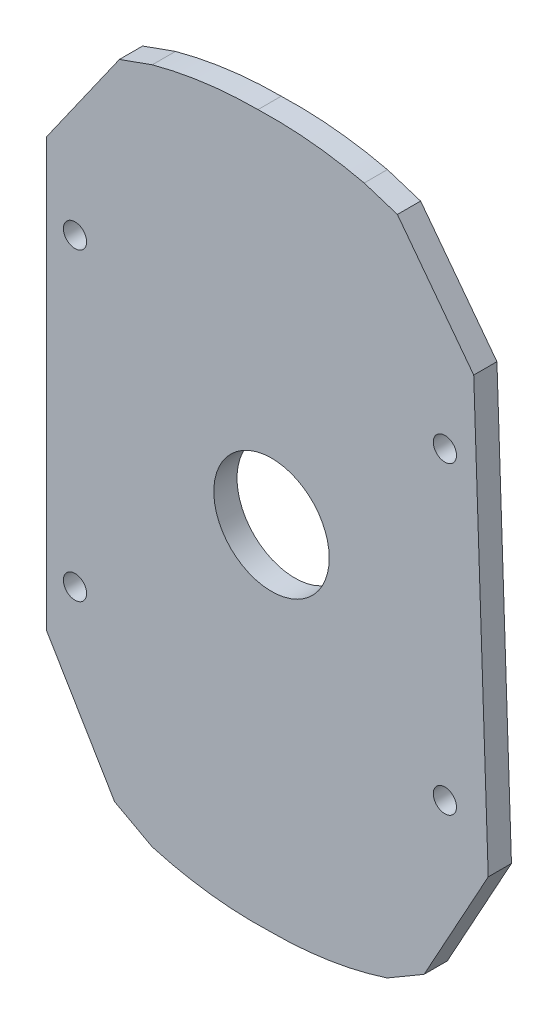
ISO-10303-21;
HEADER;
FILE_DESCRIPTION(('STEP AP214'),'2;1');
FILE_NAME('part.step','',(''),(''),'','','');
FILE_SCHEMA(('AUTOMOTIVE_DESIGN { 1 0 10303 214 1 1 1 1 }'));
ENDSEC;
DATA;
#1=APPLICATION_CONTEXT('core data for automotive mechanical design processes');
#2=APPLICATION_PROTOCOL_DEFINITION('international standard','automotive_design',2000,#1);
#3=PRODUCT_CONTEXT('',#1,'mechanical');
#4=PRODUCT('Part','Part','',(#3));
#5=PRODUCT_RELATED_PRODUCT_CATEGORY('part','',(#4));
#6=PRODUCT_DEFINITION_FORMATION('','',#4);
#7=PRODUCT_DEFINITION_CONTEXT('part definition',#1,'design');
#8=PRODUCT_DEFINITION('design','',#6,#7);
#9=PRODUCT_DEFINITION_SHAPE('','',#8);
#10=(LENGTH_UNIT() NAMED_UNIT(*) SI_UNIT(.MILLI.,.METRE.));
#11=(NAMED_UNIT(*) PLANE_ANGLE_UNIT() SI_UNIT($,.RADIAN.));
#12=(NAMED_UNIT(*) SI_UNIT($,.STERADIAN.) SOLID_ANGLE_UNIT());
#13=UNCERTAINTY_MEASURE_WITH_UNIT(LENGTH_MEASURE(1.E-05),#10,'distance_accuracy_value','');
#14=(GEOMETRIC_REPRESENTATION_CONTEXT(3) GLOBAL_UNCERTAINTY_ASSIGNED_CONTEXT((#13)) GLOBAL_UNIT_ASSIGNED_CONTEXT((#10,
#11,#12)) REPRESENTATION_CONTEXT('',''));
#15=CARTESIAN_POINT('',(0.,0.,0.));
#16=DIRECTION('',(0.,0.,1.));
#17=DIRECTION('',(1.,0.,0.));
#18=AXIS2_PLACEMENT_3D('',#15,#16,#17);
#19=CARTESIAN_POINT('',(129.915894371907,105.92812204103,3.));
#20=DIRECTION('',(0.,0.,-1.));
#21=DIRECTION('',(-1.,0.,0.));
#22=AXIS2_PLACEMENT_3D('',#19,#20,#21);
#23=CYLINDRICAL_SURFACE('',#22,52.2440105298206);
#24=CARTESIAN_POINT('',(129.915894371907,105.92812204103,0.));
#25=DIRECTION('',(0.,0.,1.));
#26=DIRECTION('',(-1.,0.,0.));
#27=AXIS2_PLACEMENT_3D('',#24,#25,#26);
#28=CIRCLE('',#27,52.2440105298206);
#29=CARTESIAN_POINT('',(129.915894371907,158.172132570851,0.));
#30=VERTEX_POINT('',#29);
#31=CARTESIAN_POINT('',(116.251704745824,156.353577498591,0.));
#32=VERTEX_POINT('',#31);
#33=EDGE_CURVE('E165',#30,#32,#28,.T.);
#34=ORIENTED_EDGE('',*,*,#33,.T.);
#35=DIRECTION('',(0.,0.,-1.));
#36=VECTOR('',#35,1.);
#37=CARTESIAN_POINT('',(116.251704745824,156.353577498591,3.));
#38=LINE('',#37,#36);
#39=CARTESIAN_POINT('',(116.251704745824,156.353577498591,3.));
#40=VERTEX_POINT('',#39);
#41=EDGE_CURVE('E11',#40,#32,#38,.T.);
#42=ORIENTED_EDGE('',*,*,#41,.F.);
#43=CARTESIAN_POINT('',(129.915894371907,105.92812204103,3.));
#44=DIRECTION('',(0.,0.,1.));
#45=DIRECTION('',(-1.,0.,0.));
#46=AXIS2_PLACEMENT_3D('',#43,#44,#45);
#47=CIRCLE('',#46,52.2440105298206);
#48=CARTESIAN_POINT('',(129.915894371907,158.172132570851,3.));
#49=VERTEX_POINT('',#48);
#50=EDGE_CURVE('E192',#49,#40,#47,.T.);
#51=ORIENTED_EDGE('',*,*,#50,.F.);
#52=DIRECTION('',(0.,0.,-1.));
#53=VECTOR('',#52,1.);
#54=CARTESIAN_POINT('',(129.915894371907,158.172132570851,3.));
#55=LINE('',#54,#53);
#56=EDGE_CURVE('E161',#49,#30,#55,.T.);
#57=ORIENTED_EDGE('',*,*,#56,.T.);
#58=EDGE_LOOP('',(#34,#42,#51,#57));
#59=FACE_BOUND('',#58,.T.);
#60=ADVANCED_FACE('F33',(#59),#23,.T.);
#61=CARTESIAN_POINT('',(116.251704745824,156.353577498591,3.));
#62=DIRECTION('',(0.336947899680271,-0.941523293870658,0.));
#63=DIRECTION('',(0.941523293870658,0.336947899680271,0.));
#64=AXIS2_PLACEMENT_3D('',#61,#62,#63);
#65=PLANE('',#64);
#66=DIRECTION('',(-0.941523293870658,-0.336947899680271,0.));
#67=VECTOR('',#66,1.);
#68=CARTESIAN_POINT('',(116.251704745824,156.353577498591,0.));
#69=LINE('',#68,#67);
#70=CARTESIAN_POINT('',(112.006054703556,154.834164358382,0.));
#71=VERTEX_POINT('',#70);
#72=EDGE_CURVE('E168',#32,#71,#69,.T.);
#73=ORIENTED_EDGE('',*,*,#72,.T.);
#74=DIRECTION('',(0.,0.,-1.));
#75=VECTOR('',#74,1.);
#76=CARTESIAN_POINT('',(112.006054703556,154.834164358382,3.));
#77=LINE('',#76,#75);
#78=CARTESIAN_POINT('',(112.006054703556,154.834164358382,3.));
#79=VERTEX_POINT('',#78);
#80=EDGE_CURVE('E41',#79,#71,#77,.T.);
#81=ORIENTED_EDGE('',*,*,#80,.F.);
#82=DIRECTION('',(-0.941523293870658,-0.336947899680271,0.));
#83=VECTOR('',#82,1.);
#84=CARTESIAN_POINT('',(116.251704745824,156.353577498591,3.));
#85=LINE('',#84,#83);
#86=EDGE_CURVE('E110',#40,#79,#85,.T.);
#87=ORIENTED_EDGE('',*,*,#86,.F.);
#88=ORIENTED_EDGE('',*,*,#41,.T.);
#89=EDGE_LOOP('',(#73,#81,#87,#88));
#90=FACE_BOUND('',#89,.T.);
#91=ADVANCED_FACE('F281',(#90),#65,.F.);
#92=CARTESIAN_POINT('',(112.006054703556,154.834164358382,3.));
#93=DIRECTION('',(0.817602562275912,-0.575782988772561,0.));
#94=DIRECTION('',(0.575782988772561,0.817602562275912,0.));
#95=AXIS2_PLACEMENT_3D('',#92,#93,#94);
#96=PLANE('',#95);
#97=DIRECTION('',(-0.575782988772561,-0.817602562275912,0.));
#98=VECTOR('',#97,1.);
#99=CARTESIAN_POINT('',(112.006054703556,154.834164358382,0.));
#100=LINE('',#99,#98);
#101=CARTESIAN_POINT('',(102.590821764849,141.464685361579,0.));
#102=VERTEX_POINT('',#101);
#103=EDGE_CURVE('E171',#71,#102,#100,.T.);
#104=ORIENTED_EDGE('',*,*,#103,.T.);
#105=DIRECTION('',(0.,0.,-1.));
#106=VECTOR('',#105,1.);
#107=CARTESIAN_POINT('',(102.590821764849,141.464685361579,3.));
#108=LINE('',#107,#106);
#109=CARTESIAN_POINT('',(102.590821764849,141.464685361579,3.));
#110=VERTEX_POINT('',#109);
#111=EDGE_CURVE('E217',#110,#102,#108,.T.);
#112=ORIENTED_EDGE('',*,*,#111,.F.);
#113=DIRECTION('',(-0.575782988772561,-0.817602562275912,0.));
#114=VECTOR('',#113,1.);
#115=CARTESIAN_POINT('',(112.006054703556,154.834164358382,3.));
#116=LINE('',#115,#114);
#117=EDGE_CURVE('E225',#79,#110,#116,.T.);
#118=ORIENTED_EDGE('',*,*,#117,.F.);
#119=ORIENTED_EDGE('',*,*,#80,.T.);
#120=EDGE_LOOP('',(#104,#112,#118,#119));
#121=FACE_BOUND('',#120,.T.);
#122=ADVANCED_FACE('F223',(#121),#96,.F.);
#123=CARTESIAN_POINT('',(102.590821764849,141.464685361579,3.));
#124=DIRECTION('',(1.,0.,0.));
#125=DIRECTION('',(0.,0.,-1.));
#126=AXIS2_PLACEMENT_3D('',#123,#124,#125);
#127=PLANE('',#126);
#128=DIRECTION('',(0.,-1.,0.));
#129=VECTOR('',#128,1.);
#130=CARTESIAN_POINT('',(102.590821764849,141.464685361579,0.));
#131=LINE('',#130,#129);
#132=CARTESIAN_POINT('',(102.590821764849,86.2136329812577,0.));
#133=VERTEX_POINT('',#132);
#134=EDGE_CURVE('E173',#102,#133,#131,.T.);
#135=ORIENTED_EDGE('',*,*,#134,.T.);
#136=DIRECTION('',(0.,0.,-1.));
#137=VECTOR('',#136,1.);
#138=CARTESIAN_POINT('',(102.590821764849,86.2136329812577,3.));
#139=LINE('',#138,#137);
#140=CARTESIAN_POINT('',(102.590821764849,86.2136329812577,3.));
#141=VERTEX_POINT('',#140);
#142=EDGE_CURVE('E214',#141,#133,#139,.T.);
#143=ORIENTED_EDGE('',*,*,#142,.F.);
#144=DIRECTION('',(0.,-1.,0.));
#145=VECTOR('',#144,1.);
#146=CARTESIAN_POINT('',(102.590821764849,141.464685361579,3.));
#147=LINE('',#146,#145);
#148=EDGE_CURVE('E243',#110,#141,#147,.T.);
#149=ORIENTED_EDGE('',*,*,#148,.F.);
#150=ORIENTED_EDGE('',*,*,#111,.T.);
#151=EDGE_LOOP('',(#135,#143,#149,#150));
#152=FACE_BOUND('',#151,.T.);
#153=ADVANCED_FACE('F234',(#152),#127,.F.);
#154=CARTESIAN_POINT('',(102.590821764849,86.2136329812577,3.));
#155=DIRECTION('',(0.859080360795223,0.5118407307903,0.));
#156=DIRECTION('',(-0.5118407307903,0.859080360795223,0.));
#157=AXIS2_PLACEMENT_3D('',#154,#155,#156);
#158=PLANE('',#157);
#159=DIRECTION('',(0.5118407307903,-0.859080360795223,0.));
#160=VECTOR('',#159,1.);
#161=CARTESIAN_POINT('',(102.590821764849,86.2136329812577,0.));
#162=LINE('',#161,#160);
#163=CARTESIAN_POINT('',(111.38506815839,71.4532516551767,0.));
#164=VERTEX_POINT('',#163);
#165=EDGE_CURVE('E175',#133,#164,#162,.T.);
#166=ORIENTED_EDGE('',*,*,#165,.T.);
#167=DIRECTION('',(0.,0.,-1.));
#168=VECTOR('',#167,1.);
#169=CARTESIAN_POINT('',(111.38506815839,71.4532516551767,3.));
#170=LINE('',#169,#168);
#171=CARTESIAN_POINT('',(111.38506815839,71.4532516551767,3.));
#172=VERTEX_POINT('',#171);
#173=EDGE_CURVE('E211',#172,#164,#170,.T.);
#174=ORIENTED_EDGE('',*,*,#173,.F.);
#175=DIRECTION('',(0.5118407307903,-0.859080360795223,0.));
#176=VECTOR('',#175,1.);
#177=CARTESIAN_POINT('',(102.590821764849,86.2136329812577,3.));
#178=LINE('',#177,#176);
#179=EDGE_CURVE('E240',#141,#172,#178,.T.);
#180=ORIENTED_EDGE('',*,*,#179,.F.);
#181=ORIENTED_EDGE('',*,*,#142,.T.);
#182=EDGE_LOOP('',(#166,#174,#180,#181));
#183=FACE_BOUND('',#182,.T.);
#184=ADVANCED_FACE('F238',(#183),#158,.F.);
#185=CARTESIAN_POINT('',(111.38506815839,71.4532516551767,3.));
#186=DIRECTION('',(0.476038132608103,0.879424639354044,0.));
#187=DIRECTION('',(-0.879424639354044,0.476038132608103,0.));
#188=AXIS2_PLACEMENT_3D('',#185,#186,#187);
#189=PLANE('',#188);
#190=DIRECTION('',(0.879424639354044,-0.476038132608103,0.));
#191=VECTOR('',#190,1.);
#192=CARTESIAN_POINT('',(111.38506815839,71.4532516551767,0.));
#193=LINE('',#192,#191);
#194=CARTESIAN_POINT('',(116.251704745824,68.8189104171758,0.));
#195=VERTEX_POINT('',#194);
#196=EDGE_CURVE('E177',#164,#195,#193,.T.);
#197=ORIENTED_EDGE('',*,*,#196,.T.);
#198=DIRECTION('',(0.,0.,-1.));
#199=VECTOR('',#198,1.);
#200=CARTESIAN_POINT('',(116.251704745824,68.8189104171758,3.));
#201=LINE('',#200,#199);
#202=CARTESIAN_POINT('',(116.251704745824,68.8189104171758,3.));
#203=VERTEX_POINT('',#202);
#204=EDGE_CURVE('E208',#203,#195,#201,.T.);
#205=ORIENTED_EDGE('',*,*,#204,.F.);
#206=DIRECTION('',(0.879424639354044,-0.476038132608103,0.));
#207=VECTOR('',#206,1.);
#208=CARTESIAN_POINT('',(111.38506815839,71.4532516551767,3.));
#209=LINE('',#208,#207);
#210=EDGE_CURVE('E242',#172,#203,#209,.T.);
#211=ORIENTED_EDGE('',*,*,#210,.F.);
#212=ORIENTED_EDGE('',*,*,#173,.T.);
#213=EDGE_LOOP('',(#197,#205,#211,#212));
#214=FACE_BOUND('',#213,.T.);
#215=ADVANCED_FACE('F294',(#214),#189,.F.);
#216=CARTESIAN_POINT('',(129.643912803425,115.47761332187,3.));
#217=DIRECTION('',(0.,0.,-1.));
#218=DIRECTION('',(-1.,0.,0.));
#219=AXIS2_PLACEMENT_3D('',#216,#217,#218);
#220=CYLINDRICAL_SURFACE('',#219,48.5426183204673);
#221=CARTESIAN_POINT('',(129.643912803425,115.47761332187,0.));
#222=DIRECTION('',(0.,0.,1.));
#223=DIRECTION('',(1.,0.,0.));
#224=AXIS2_PLACEMENT_3D('',#221,#222,#223);
#225=CIRCLE('',#224,48.5426183204673);
#226=CARTESIAN_POINT('',(131.464672298688,66.9691539743808,0.));
#227=VERTEX_POINT('',#226);
#228=EDGE_CURVE('E179',#195,#227,#225,.T.);
#229=ORIENTED_EDGE('',*,*,#228,.T.);
#230=DIRECTION('',(0.,0.,-1.));
#231=VECTOR('',#230,1.);
#232=CARTESIAN_POINT('',(131.464672298688,66.9691539743808,3.));
#233=LINE('',#232,#231);
#234=CARTESIAN_POINT('',(131.464672298688,66.9691539743808,3.));
#235=VERTEX_POINT('',#234);
#236=EDGE_CURVE('E205',#235,#227,#233,.T.);
#237=ORIENTED_EDGE('',*,*,#236,.F.);
#238=CARTESIAN_POINT('',(129.643912803425,115.47761332187,3.));
#239=DIRECTION('',(0.,0.,1.));
#240=DIRECTION('',(1.,0.,0.));
#241=AXIS2_PLACEMENT_3D('',#238,#239,#240);
#242=CIRCLE('',#241,48.5426183204673);
#243=EDGE_CURVE('E245',#203,#235,#242,.T.);
#244=ORIENTED_EDGE('',*,*,#243,.F.);
#245=ORIENTED_EDGE('',*,*,#204,.T.);
#246=EDGE_LOOP('',(#229,#237,#244,#245));
#247=FACE_BOUND('',#246,.T.);
#248=ADVANCED_FACE('F297',(#247),#220,.T.);
#249=CARTESIAN_POINT('',(131.637348655565,115.511465170721,3.));
#250=DIRECTION('',(0.,0.,-1.));
#251=DIRECTION('',(-1.,0.,0.));
#252=AXIS2_PLACEMENT_3D('',#249,#250,#251);
#253=CYLINDRICAL_SURFACE('',#252,48.5426183204674);
#254=CARTESIAN_POINT('',(131.637348655565,115.511465170721,0.));
#255=DIRECTION('',(0.,0.,1.));
#256=DIRECTION('',(-1.,0.,0.));
#257=AXIS2_PLACEMENT_3D('',#254,#255,#256);
#258=CIRCLE('',#257,48.5426183204674);
#259=CARTESIAN_POINT('',(146.606062492151,69.3343777843889,0.));
#260=VERTEX_POINT('',#259);
#261=EDGE_CURVE('E181',#227,#260,#258,.T.);
#262=ORIENTED_EDGE('',*,*,#261,.T.);
#263=DIRECTION('',(0.,0.,-1.));
#264=VECTOR('',#263,1.);
#265=CARTESIAN_POINT('',(146.606062492151,69.3343777843889,3.));
#266=LINE('',#265,#264);
#267=CARTESIAN_POINT('',(146.606062492151,69.3343777843889,3.));
#268=VERTEX_POINT('',#267);
#269=EDGE_CURVE('E202',#268,#260,#266,.T.);
#270=ORIENTED_EDGE('',*,*,#269,.F.);
#271=CARTESIAN_POINT('',(131.637348655565,115.511465170721,3.));
#272=DIRECTION('',(0.,0.,1.));
#273=DIRECTION('',(-1.,0.,0.));
#274=AXIS2_PLACEMENT_3D('',#271,#272,#273);
#275=CIRCLE('',#274,48.5426183204674);
#276=EDGE_CURVE('E251',#235,#268,#275,.T.);
#277=ORIENTED_EDGE('',*,*,#276,.F.);
#278=ORIENTED_EDGE('',*,*,#236,.T.);
#279=EDGE_LOOP('',(#262,#270,#277,#278));
#280=FACE_BOUND('',#279,.T.);
#281=ADVANCED_FACE('F301',(#280),#253,.T.);
#282=CARTESIAN_POINT('',(151.380447861165,72.1324395743667,3.));
#283=DIRECTION('',(-0.505623223828784,0.862754400466893,0.));
#284=DIRECTION('',(-0.862754400466893,-0.505623223828784,0.));
#285=AXIS2_PLACEMENT_3D('',#282,#283,#284);
#286=PLANE('',#285);
#287=DIRECTION('',(0.862754400466893,0.505623223828784,0.));
#288=VECTOR('',#287,1.);
#289=CARTESIAN_POINT('',(151.380447861165,72.1324395743667,0.));
#290=LINE('',#289,#288);
#291=CARTESIAN_POINT('',(151.380447861165,72.1324395743667,0.));
#292=VERTEX_POINT('',#291);
#293=EDGE_CURVE('E183',#260,#292,#290,.T.);
#294=ORIENTED_EDGE('',*,*,#293,.T.);
#295=DIRECTION('',(0.,0.,-1.));
#296=VECTOR('',#295,1.);
#297=CARTESIAN_POINT('',(151.380447861165,72.1324395743667,3.));
#298=LINE('',#297,#296);
#299=CARTESIAN_POINT('',(151.380447861165,72.1324395743667,3.));
#300=VERTEX_POINT('',#299);
#301=EDGE_CURVE('E199',#300,#292,#298,.T.);
#302=ORIENTED_EDGE('',*,*,#301,.F.);
#303=DIRECTION('',(0.862754400466893,0.505623223828784,0.));
#304=VECTOR('',#303,1.);
#305=CARTESIAN_POINT('',(151.380447861165,72.1324395743667,3.));
#306=LINE('',#305,#304);
#307=EDGE_CURVE('E253',#268,#300,#306,.T.);
#308=ORIENTED_EDGE('',*,*,#307,.F.);
#309=ORIENTED_EDGE('',*,*,#269,.T.);
#310=EDGE_LOOP('',(#294,#302,#308,#309));
#311=FACE_BOUND('',#310,.T.);
#312=ADVANCED_FACE('F305',(#311),#286,.F.);
#313=CARTESIAN_POINT('',(159.668456590164,87.1829059402191,3.));
#314=DIRECTION('',(-0.8759638243808,0.482376801241688,0.));
#315=DIRECTION('',(-0.482376801241688,-0.8759638243808,0.));
#316=AXIS2_PLACEMENT_3D('',#313,#314,#315);
#317=PLANE('',#316);
#318=DIRECTION('',(0.482376801241688,0.8759638243808,0.));
#319=VECTOR('',#318,1.);
#320=CARTESIAN_POINT('',(159.668456590164,87.1829059402191,0.));
#321=LINE('',#320,#319);
#322=CARTESIAN_POINT('',(159.668456590164,87.1829059402191,0.));
#323=VERTEX_POINT('',#322);
#324=EDGE_CURVE('E185',#292,#323,#321,.T.);
#325=ORIENTED_EDGE('',*,*,#324,.T.);
#326=DIRECTION('',(0.,0.,-1.));
#327=VECTOR('',#326,1.);
#328=CARTESIAN_POINT('',(159.668456590164,87.1829059402191,3.));
#329=LINE('',#328,#327);
#330=CARTESIAN_POINT('',(159.668456590164,87.1829059402191,3.));
#331=VERTEX_POINT('',#330);
#332=EDGE_CURVE('E196',#331,#323,#329,.T.);
#333=ORIENTED_EDGE('',*,*,#332,.F.);
#334=DIRECTION('',(0.482376801241688,0.8759638243808,0.));
#335=VECTOR('',#334,1.);
#336=CARTESIAN_POINT('',(159.668456590164,87.1829059402191,3.));
#337=LINE('',#336,#335);
#338=EDGE_CURVE('E255',#300,#331,#337,.T.);
#339=ORIENTED_EDGE('',*,*,#338,.F.);
#340=ORIENTED_EDGE('',*,*,#301,.T.);
#341=EDGE_LOOP('',(#325,#333,#339,#340));
#342=FACE_BOUND('',#341,.T.);
#343=ADVANCED_FACE('F261',(#342),#317,.F.);
#344=CARTESIAN_POINT('',(157.792488460064,142.402101268546,3.));
#345=DIRECTION('',(-0.999423412756455,-0.0339535275669755,0.));
#346=DIRECTION('',(0.0339535275669755,-0.999423412756455,0.));
#347=AXIS2_PLACEMENT_3D('',#344,#345,#346);
#348=PLANE('',#347);
#349=DIRECTION('',(-0.0339535275669755,0.999423412756455,0.));
#350=VECTOR('',#349,1.);
#351=CARTESIAN_POINT('',(157.792488460064,142.402101268546,0.));
#352=LINE('',#351,#350);
#353=CARTESIAN_POINT('',(157.792488460064,142.402101268546,0.));
#354=VERTEX_POINT('',#353);
#355=EDGE_CURVE('E187',#323,#354,#352,.T.);
#356=ORIENTED_EDGE('',*,*,#355,.T.);
#357=DIRECTION('',(0.,0.,-1.));
#358=VECTOR('',#357,1.);
#359=CARTESIAN_POINT('',(157.792488460064,142.402101268546,3.));
#360=LINE('',#359,#358);
#361=CARTESIAN_POINT('',(157.792488460064,142.402101268546,3.));
#362=VERTEX_POINT('',#361);
#363=EDGE_CURVE('E156',#362,#354,#360,.T.);
#364=ORIENTED_EDGE('',*,*,#363,.F.);
#365=DIRECTION('',(-0.0339535275669755,0.999423412756455,0.));
#366=VECTOR('',#365,1.);
#367=CARTESIAN_POINT('',(157.792488460064,142.402101268546,3.));
#368=LINE('',#367,#366);
#369=EDGE_CURVE('E147',#331,#362,#368,.T.);
#370=ORIENTED_EDGE('',*,*,#369,.F.);
#371=ORIENTED_EDGE('',*,*,#332,.T.);
#372=EDGE_LOOP('',(#356,#364,#370,#371));
#373=FACE_BOUND('',#372,.T.);
#374=ADVANCED_FACE('F265',(#373),#348,.F.);
#375=CARTESIAN_POINT('',(147.928743250891,155.444191223172,3.));
#376=DIRECTION('',(-0.79758127948633,-0.603211490783248,0.));
#377=DIRECTION('',(0.603211490783249,-0.79758127948633,0.));
#378=AXIS2_PLACEMENT_3D('',#375,#376,#377);
#379=PLANE('',#378);
#380=DIRECTION('',(-0.603211490783248,0.79758127948633,0.));
#381=VECTOR('',#380,1.);
#382=CARTESIAN_POINT('',(147.928743250891,155.444191223172,0.));
#383=LINE('',#382,#381);
#384=CARTESIAN_POINT('',(147.928743250891,155.444191223172,0.));
#385=VERTEX_POINT('',#384);
#386=EDGE_CURVE('E155',#354,#385,#383,.T.);
#387=ORIENTED_EDGE('',*,*,#386,.T.);
#388=DIRECTION('',(0.,0.,-1.));
#389=VECTOR('',#388,1.);
#390=CARTESIAN_POINT('',(147.928743250891,155.444191223172,3.));
#391=LINE('',#390,#389);
#392=CARTESIAN_POINT('',(147.928743250891,155.444191223172,3.));
#393=VERTEX_POINT('',#392);
#394=EDGE_CURVE('E152',#393,#385,#391,.T.);
#395=ORIENTED_EDGE('',*,*,#394,.F.);
#396=DIRECTION('',(-0.603211490783248,0.79758127948633,0.));
#397=VECTOR('',#396,1.);
#398=CARTESIAN_POINT('',(147.928743250891,155.444191223172,3.));
#399=LINE('',#398,#397);
#400=EDGE_CURVE('E141',#362,#393,#399,.T.);
#401=ORIENTED_EDGE('',*,*,#400,.F.);
#402=ORIENTED_EDGE('',*,*,#363,.T.);
#403=EDGE_LOOP('',(#387,#395,#401,#402));
#404=FACE_BOUND('',#403,.T.);
#405=ADVANCED_FACE('F153',(#404),#379,.F.);
#406=CARTESIAN_POINT('',(143.633951760336,156.818573493397,3.));
#407=DIRECTION('',(-0.304785582706198,-0.952420993350337,0.));
#408=DIRECTION('',(0.952420993350337,-0.304785582706198,0.));
#409=AXIS2_PLACEMENT_3D('',#406,#407,#408);
#410=PLANE('',#409);
#411=DIRECTION('',(-0.952420993350337,0.304785582706198,0.));
#412=VECTOR('',#411,1.);
#413=CARTESIAN_POINT('',(143.633951760336,156.818573493397,0.));
#414=LINE('',#413,#412);
#415=CARTESIAN_POINT('',(143.633951760336,156.818573493397,0.));
#416=VERTEX_POINT('',#415);
#417=EDGE_CURVE('E96',#385,#416,#414,.T.);
#418=ORIENTED_EDGE('',*,*,#417,.T.);
#419=DIRECTION('',(0.,0.,-1.));
#420=VECTOR('',#419,1.);
#421=CARTESIAN_POINT('',(143.633951760336,156.818573493397,3.));
#422=LINE('',#421,#420);
#423=CARTESIAN_POINT('',(143.633951760336,156.818573493397,3.));
#424=VERTEX_POINT('',#423);
#425=EDGE_CURVE('E157',#424,#416,#422,.T.);
#426=ORIENTED_EDGE('',*,*,#425,.F.);
#427=DIRECTION('',(-0.952420993350337,0.304785582706198,0.));
#428=VECTOR('',#427,1.);
#429=CARTESIAN_POINT('',(143.633951760336,156.818573493397,3.));
#430=LINE('',#429,#428);
#431=EDGE_CURVE('E145',#393,#424,#430,.T.);
#432=ORIENTED_EDGE('',*,*,#431,.F.);
#433=ORIENTED_EDGE('',*,*,#394,.T.);
#434=EDGE_LOOP('',(#418,#426,#432,#433));
#435=FACE_BOUND('',#434,.T.);
#436=ADVANCED_FACE('F159',(#435),#410,.F.);
#437=CARTESIAN_POINT('',(131.689762823641,105.958245271053,3.));
#438=DIRECTION('',(0.,0.,-1.));
#439=DIRECTION('',(-1.,0.,0.));
#440=AXIS2_PLACEMENT_3D('',#437,#438,#439);
#441=CYLINDRICAL_SURFACE('',#440,52.2440105298206);
#442=CARTESIAN_POINT('',(131.689762823641,105.958245271053,0.));
#443=DIRECTION('',(0.,0.,1.));
#444=DIRECTION('',(1.,0.,0.));
#445=AXIS2_PLACEMENT_3D('',#442,#443,#444);
#446=CIRCLE('',#445,52.2440105298206);
#447=EDGE_CURVE('E102',#416,#30,#446,.T.);
#448=ORIENTED_EDGE('',*,*,#447,.T.);
#449=ORIENTED_EDGE('',*,*,#56,.F.);
#450=CARTESIAN_POINT('',(131.689762823641,105.958245271053,3.));
#451=DIRECTION('',(0.,0.,1.));
#452=DIRECTION('',(1.,0.,0.));
#453=AXIS2_PLACEMENT_3D('',#450,#451,#452);
#454=CIRCLE('',#453,52.2440105298206);
#455=EDGE_CURVE('E49',#424,#49,#454,.T.);
#456=ORIENTED_EDGE('',*,*,#455,.F.);
#457=ORIENTED_EDGE('',*,*,#425,.T.);
#458=EDGE_LOOP('',(#448,#449,#456,#457));
#459=FACE_BOUND('',#458,.T.);
#460=ADVANCED_FACE('F269',(#459),#441,.T.);
#461=CARTESIAN_POINT('',(129.915894371907,105.92812204103,3.));
#462=DIRECTION('',(0.,0.,-1.));
#463=DIRECTION('',(-1.,0.,0.));
#464=AXIS2_PLACEMENT_3D('',#461,#462,#463);
#465=PLANE('',#464);
#466=CARTESIAN_POINT('',(106.270821764849,92.9436329812577,3.));
#467=DIRECTION('',(0.,0.,1.));
#468=DIRECTION('',(1.,0.,0.));
#469=AXIS2_PLACEMENT_3D('',#466,#467,#468);
#470=CIRCLE('',#469,1.5);
#471=CARTESIAN_POINT('',(107.770821764849,92.9436329812577,3.));
#472=VERTEX_POINT('',#471);
#473=EDGE_CURVE('E401',#472,#472,#470,.T.);
#474=ORIENTED_EDGE('',*,*,#473,.F.);
#475=EDGE_LOOP('',(#474));
#476=FACE_BOUND('',#475,.T.);
#477=CARTESIAN_POINT('',(154.065868873458,132.294685361579,3.));
#478=DIRECTION('',(0.,0.,1.));
#479=DIRECTION('',(1.,0.,0.));
#480=AXIS2_PLACEMENT_3D('',#477,#478,#479);
#481=CIRCLE('',#480,1.5);
#482=CARTESIAN_POINT('',(155.565868873458,132.294685361579,3.));
#483=VERTEX_POINT('',#482);
#484=EDGE_CURVE('E407',#483,#483,#481,.T.);
#485=ORIENTED_EDGE('',*,*,#484,.F.);
#486=EDGE_LOOP('',(#485));
#487=FACE_BOUND('',#486,.T.);
#488=CARTESIAN_POINT('',(154.065868873458,92.9436329812577,3.));
#489=DIRECTION('',(0.,0.,1.));
#490=DIRECTION('',(1.,0.,0.));
#491=AXIS2_PLACEMENT_3D('',#488,#489,#490);
#492=CIRCLE('',#491,1.5);
#493=CARTESIAN_POINT('',(155.565868873458,92.9436329812577,3.));
#494=VERTEX_POINT('',#493);
#495=EDGE_CURVE('E427',#494,#494,#492,.T.);
#496=ORIENTED_EDGE('',*,*,#495,.F.);
#497=EDGE_LOOP('',(#496));
#498=FACE_BOUND('',#497,.T.);
#499=CARTESIAN_POINT('',(131.663555739603,112.585551325564,3.));
#500=DIRECTION('',(0.,0.,1.));
#501=DIRECTION('',(1.,0.,0.));
#502=AXIS2_PLACEMENT_3D('',#499,#500,#501);
#503=CIRCLE('',#502,7.46);
#504=CARTESIAN_POINT('',(139.123555739603,112.585551325564,3.));
#505=VERTEX_POINT('',#504);
#506=EDGE_CURVE('E436',#505,#505,#503,.T.);
#507=ORIENTED_EDGE('',*,*,#506,.F.);
#508=EDGE_LOOP('',(#507));
#509=FACE_BOUND('',#508,.T.);
#510=CARTESIAN_POINT('',(106.270821764849,132.294685361579,3.));
#511=DIRECTION('',(0.,0.,1.));
#512=DIRECTION('',(1.,0.,0.));
#513=AXIS2_PLACEMENT_3D('',#510,#511,#512);
#514=CIRCLE('',#513,1.5);
#515=CARTESIAN_POINT('',(107.770821764849,132.294685361579,3.));
#516=VERTEX_POINT('',#515);
#517=EDGE_CURVE('E404',#516,#516,#514,.T.);
#518=ORIENTED_EDGE('',*,*,#517,.F.);
#519=EDGE_LOOP('',(#518));
#520=FACE_BOUND('',#519,.T.);
#521=ORIENTED_EDGE('',*,*,#50,.T.);
#522=ORIENTED_EDGE('',*,*,#86,.T.);
#523=ORIENTED_EDGE('',*,*,#117,.T.);
#524=ORIENTED_EDGE('',*,*,#148,.T.);
#525=ORIENTED_EDGE('',*,*,#179,.T.);
#526=ORIENTED_EDGE('',*,*,#210,.T.);
#527=ORIENTED_EDGE('',*,*,#243,.T.);
#528=ORIENTED_EDGE('',*,*,#276,.T.);
#529=ORIENTED_EDGE('',*,*,#307,.T.);
#530=ORIENTED_EDGE('',*,*,#338,.T.);
#531=ORIENTED_EDGE('',*,*,#369,.T.);
#532=ORIENTED_EDGE('',*,*,#400,.T.);
#533=ORIENTED_EDGE('',*,*,#431,.T.);
#534=ORIENTED_EDGE('',*,*,#455,.T.);
#535=EDGE_LOOP('',(#521,#522,#523,#524,#525,#526,#527,#528,#529,#530,#531,#532,#533,#534));
#536=FACE_BOUND('',#535,.T.);
#537=ADVANCED_FACE('F143',(#476,#487,#498,#509,#520,#536),#465,.F.);
#538=CARTESIAN_POINT('',(129.915894371907,105.92812204103,0.));
#539=DIRECTION('',(0.,0.,-1.));
#540=DIRECTION('',(-1.,0.,0.));
#541=AXIS2_PLACEMENT_3D('',#538,#539,#540);
#542=PLANE('',#541);
#543=CARTESIAN_POINT('',(106.270821764849,92.9436329812577,0.));
#544=DIRECTION('',(0.,0.,1.));
#545=DIRECTION('',(1.,0.,0.));
#546=AXIS2_PLACEMENT_3D('',#543,#544,#545);
#547=CIRCLE('',#546,1.5);
#548=CARTESIAN_POINT('',(107.770821764849,92.9436329812577,0.));
#549=VERTEX_POINT('',#548);
#550=EDGE_CURVE('E398',#549,#549,#547,.T.);
#551=ORIENTED_EDGE('',*,*,#550,.T.);
#552=EDGE_LOOP('',(#551));
#553=FACE_BOUND('',#552,.T.);
#554=CARTESIAN_POINT('',(154.065868873458,132.294685361579,0.));
#555=DIRECTION('',(0.,0.,1.));
#556=DIRECTION('',(1.,0.,0.));
#557=AXIS2_PLACEMENT_3D('',#554,#555,#556);
#558=CIRCLE('',#557,1.5);
#559=CARTESIAN_POINT('',(155.565868873458,132.294685361579,0.));
#560=VERTEX_POINT('',#559);
#561=EDGE_CURVE('E402',#560,#560,#558,.T.);
#562=ORIENTED_EDGE('',*,*,#561,.T.);
#563=EDGE_LOOP('',(#562));
#564=FACE_BOUND('',#563,.T.);
#565=CARTESIAN_POINT('',(154.065868873458,92.9436329812577,0.));
#566=DIRECTION('',(0.,0.,1.));
#567=DIRECTION('',(1.,0.,0.));
#568=AXIS2_PLACEMENT_3D('',#565,#566,#567);
#569=CIRCLE('',#568,1.5);
#570=CARTESIAN_POINT('',(155.565868873458,92.9436329812577,0.));
#571=VERTEX_POINT('',#570);
#572=EDGE_CURVE('E413',#571,#571,#569,.T.);
#573=ORIENTED_EDGE('',*,*,#572,.T.);
#574=EDGE_LOOP('',(#573));
#575=FACE_BOUND('',#574,.T.);
#576=CARTESIAN_POINT('',(131.663555739603,112.585551325564,0.));
#577=DIRECTION('',(0.,0.,1.));
#578=DIRECTION('',(1.,0.,0.));
#579=AXIS2_PLACEMENT_3D('',#576,#577,#578);
#580=CIRCLE('',#579,7.46);
#581=CARTESIAN_POINT('',(139.123555739603,112.585551325564,0.));
#582=VERTEX_POINT('',#581);
#583=EDGE_CURVE('E432',#582,#582,#580,.T.);
#584=ORIENTED_EDGE('',*,*,#583,.T.);
#585=EDGE_LOOP('',(#584));
#586=FACE_BOUND('',#585,.T.);
#587=CARTESIAN_POINT('',(106.270821764849,132.294685361579,0.));
#588=DIRECTION('',(0.,0.,1.));
#589=DIRECTION('',(1.,0.,0.));
#590=AXIS2_PLACEMENT_3D('',#587,#588,#589);
#591=CIRCLE('',#590,1.5);
#592=CARTESIAN_POINT('',(107.770821764849,132.294685361579,0.));
#593=VERTEX_POINT('',#592);
#594=EDGE_CURVE('E169',#593,#593,#591,.T.);
#595=ORIENTED_EDGE('',*,*,#594,.T.);
#596=EDGE_LOOP('',(#595));
#597=FACE_BOUND('',#596,.T.);
#598=ORIENTED_EDGE('',*,*,#33,.F.);
#599=ORIENTED_EDGE('',*,*,#447,.F.);
#600=ORIENTED_EDGE('',*,*,#417,.F.);
#601=ORIENTED_EDGE('',*,*,#386,.F.);
#602=ORIENTED_EDGE('',*,*,#355,.F.);
#603=ORIENTED_EDGE('',*,*,#324,.F.);
#604=ORIENTED_EDGE('',*,*,#293,.F.);
#605=ORIENTED_EDGE('',*,*,#261,.F.);
#606=ORIENTED_EDGE('',*,*,#228,.F.);
#607=ORIENTED_EDGE('',*,*,#196,.F.);
#608=ORIENTED_EDGE('',*,*,#165,.F.);
#609=ORIENTED_EDGE('',*,*,#134,.F.);
#610=ORIENTED_EDGE('',*,*,#103,.F.);
#611=ORIENTED_EDGE('',*,*,#72,.F.);
#612=EDGE_LOOP('',(#598,#599,#600,#601,#602,#603,#604,#605,#606,#607,#608,#609,#610,#611));
#613=FACE_BOUND('',#612,.T.);
#614=ADVANCED_FACE('F229',(#553,#564,#575,#586,#597,#613),#542,.T.);
#615=CARTESIAN_POINT('',(106.270821764849,132.294685361579,0.));
#616=DIRECTION('',(0.,0.,1.));
#617=DIRECTION('',(1.,0.,0.));
#618=AXIS2_PLACEMENT_3D('',#615,#616,#617);
#619=CYLINDRICAL_SURFACE('',#618,1.5);
#620=ORIENTED_EDGE('',*,*,#594,.F.);
#621=EDGE_LOOP('',(#620));
#622=FACE_BOUND('',#621,.T.);
#623=ORIENTED_EDGE('',*,*,#517,.T.);
#624=EDGE_LOOP('',(#623));
#625=FACE_BOUND('',#624,.T.);
#626=ADVANCED_FACE('F342',(#622,#625),#619,.F.);
#627=CARTESIAN_POINT('',(131.663555739603,112.585551325564,0.));
#628=DIRECTION('',(0.,0.,1.));
#629=DIRECTION('',(1.,0.,0.));
#630=AXIS2_PLACEMENT_3D('',#627,#628,#629);
#631=CYLINDRICAL_SURFACE('',#630,7.46);
#632=ORIENTED_EDGE('',*,*,#583,.F.);
#633=EDGE_LOOP('',(#632));
#634=FACE_BOUND('',#633,.T.);
#635=ORIENTED_EDGE('',*,*,#506,.T.);
#636=EDGE_LOOP('',(#635));
#637=FACE_BOUND('',#636,.T.);
#638=ADVANCED_FACE('F351',(#634,#637),#631,.F.);
#639=CARTESIAN_POINT('',(154.065868873458,92.9436329812577,0.));
#640=DIRECTION('',(0.,0.,1.));
#641=DIRECTION('',(1.,0.,0.));
#642=AXIS2_PLACEMENT_3D('',#639,#640,#641);
#643=CYLINDRICAL_SURFACE('',#642,1.5);
#644=ORIENTED_EDGE('',*,*,#572,.F.);
#645=EDGE_LOOP('',(#644));
#646=FACE_BOUND('',#645,.T.);
#647=ORIENTED_EDGE('',*,*,#495,.T.);
#648=EDGE_LOOP('',(#647));
#649=FACE_BOUND('',#648,.T.);
#650=ADVANCED_FACE('F361',(#646,#649),#643,.F.);
#651=CARTESIAN_POINT('',(154.065868873458,132.294685361579,0.));
#652=DIRECTION('',(0.,0.,1.));
#653=DIRECTION('',(1.,0.,0.));
#654=AXIS2_PLACEMENT_3D('',#651,#652,#653);
#655=CYLINDRICAL_SURFACE('',#654,1.5);
#656=ORIENTED_EDGE('',*,*,#561,.F.);
#657=EDGE_LOOP('',(#656));
#658=FACE_BOUND('',#657,.T.);
#659=ORIENTED_EDGE('',*,*,#484,.T.);
#660=EDGE_LOOP('',(#659));
#661=FACE_BOUND('',#660,.T.);
#662=ADVANCED_FACE('F371',(#658,#661),#655,.F.);
#663=CARTESIAN_POINT('',(106.270821764849,92.9436329812577,0.));
#664=DIRECTION('',(0.,0.,1.));
#665=DIRECTION('',(1.,0.,0.));
#666=AXIS2_PLACEMENT_3D('',#663,#664,#665);
#667=CYLINDRICAL_SURFACE('',#666,1.5);
#668=ORIENTED_EDGE('',*,*,#550,.F.);
#669=EDGE_LOOP('',(#668));
#670=FACE_BOUND('',#669,.T.);
#671=ORIENTED_EDGE('',*,*,#473,.T.);
#672=EDGE_LOOP('',(#671));
#673=FACE_BOUND('',#672,.T.);
#674=ADVANCED_FACE('F381',(#670,#673),#667,.F.);
#675=CLOSED_SHELL('',(#60,#91,#122,#153,#184,#215,#248,#281,#312,#343,#374,#405,#436,#460,#537,
#614,#626,#638,#650,#662,#674));
#676=MANIFOLD_SOLID_BREP('B2',#675);
#677=ADVANCED_BREP_SHAPE_REPRESENTATION('',(#18,#676),#14);
#678=SHAPE_DEFINITION_REPRESENTATION(#9,#677);
ENDSEC;
END-ISO-10303-21;
